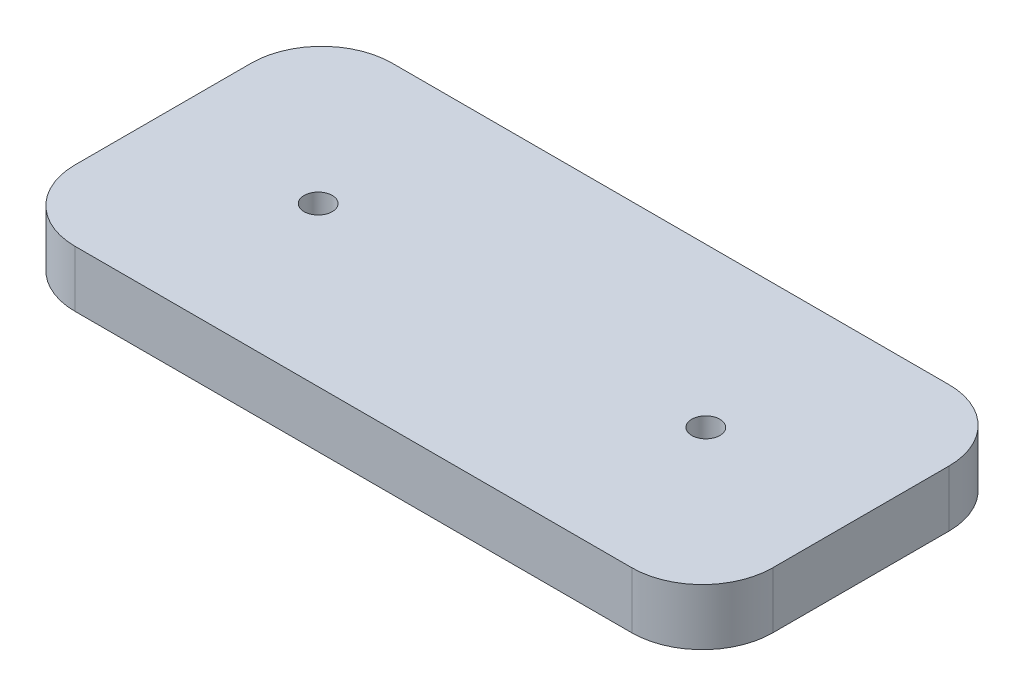
ISO-10303-21;
HEADER;
FILE_DESCRIPTION(('STEP AP214'),'2;1');
FILE_NAME('part.step','',(''),(''),'','','');
FILE_SCHEMA(('AUTOMOTIVE_DESIGN { 1 0 10303 214 1 1 1 1 }'));
ENDSEC;
DATA;
#1=APPLICATION_CONTEXT('core data for automotive mechanical design processes');
#2=APPLICATION_PROTOCOL_DEFINITION('international standard','automotive_design',2000,#1);
#3=PRODUCT_CONTEXT('',#1,'mechanical');
#4=PRODUCT('Part','Part','',(#3));
#5=PRODUCT_RELATED_PRODUCT_CATEGORY('part','',(#4));
#6=PRODUCT_DEFINITION_FORMATION('','',#4);
#7=PRODUCT_DEFINITION_CONTEXT('part definition',#1,'design');
#8=PRODUCT_DEFINITION('design','',#6,#7);
#9=PRODUCT_DEFINITION_SHAPE('','',#8);
#10=(LENGTH_UNIT() NAMED_UNIT(*) SI_UNIT(.MILLI.,.METRE.));
#11=(NAMED_UNIT(*) PLANE_ANGLE_UNIT() SI_UNIT($,.RADIAN.));
#12=(NAMED_UNIT(*) SI_UNIT($,.STERADIAN.) SOLID_ANGLE_UNIT());
#13=UNCERTAINTY_MEASURE_WITH_UNIT(LENGTH_MEASURE(1.E-05),#10,'distance_accuracy_value','');
#14=(GEOMETRIC_REPRESENTATION_CONTEXT(3) GLOBAL_UNCERTAINTY_ASSIGNED_CONTEXT((#13)) GLOBAL_UNIT_ASSIGNED_CONTEXT((#10,
#11,#12)) REPRESENTATION_CONTEXT('',''));
#15=CARTESIAN_POINT('',(0.,0.,0.));
#16=DIRECTION('',(0.,0.,1.));
#17=DIRECTION('',(1.,0.,0.));
#18=AXIS2_PLACEMENT_3D('',#15,#16,#17);
#19=CARTESIAN_POINT('',(0.,8.,0.));
#20=DIRECTION('',(0.,-1.,0.));
#21=DIRECTION('',(0.,0.,-1.));
#22=AXIS2_PLACEMENT_3D('',#19,#20,#21);
#23=PLANE('',#22);
#24=DIRECTION('',(-1.,0.,0.));
#25=VECTOR('',#24,1.);
#26=CARTESIAN_POINT('',(0.,8.,-45.));
#27=LINE('',#26,#25);
#28=CARTESIAN_POINT('',(89.,8.,-45.));
#29=VERTEX_POINT('',#28);
#30=CARTESIAN_POINT('',(10.,8.,-45.));
#31=VERTEX_POINT('',#30);
#32=EDGE_CURVE('E140',#29,#31,#27,.T.);
#33=ORIENTED_EDGE('',*,*,#32,.T.);
#34=CARTESIAN_POINT('',(10.,8.,-35.));
#35=DIRECTION('',(0.,-1.,0.));
#36=DIRECTION('',(0.,0.,-1.));
#37=AXIS2_PLACEMENT_3D('',#34,#35,#36);
#38=CIRCLE('',#37,10.);
#39=CARTESIAN_POINT('',(0.,8.,-35.));
#40=VERTEX_POINT('',#39);
#41=EDGE_CURVE('E159',#31,#40,#38,.F.);
#42=ORIENTED_EDGE('',*,*,#41,.T.);
#43=DIRECTION('',(0.,0.,1.));
#44=VECTOR('',#43,1.);
#45=CARTESIAN_POINT('',(0.,8.,0.));
#46=LINE('',#45,#44);
#47=CARTESIAN_POINT('',(0.,8.,-10.));
#48=VERTEX_POINT('',#47);
#49=EDGE_CURVE('E123',#40,#48,#46,.T.);
#50=ORIENTED_EDGE('',*,*,#49,.T.);
#51=CARTESIAN_POINT('',(10.,8.,-10.));
#52=DIRECTION('',(0.,-1.,0.));
#53=DIRECTION('',(0.,0.,-1.));
#54=AXIS2_PLACEMENT_3D('',#51,#52,#53);
#55=CIRCLE('',#54,10.);
#56=CARTESIAN_POINT('',(10.,8.,0.));
#57=VERTEX_POINT('',#56);
#58=EDGE_CURVE('E154',#48,#57,#55,.F.);
#59=ORIENTED_EDGE('',*,*,#58,.T.);
#60=DIRECTION('',(1.,0.,0.));
#61=VECTOR('',#60,1.);
#62=CARTESIAN_POINT('',(0.,8.,0.));
#63=LINE('',#62,#61);
#64=CARTESIAN_POINT('',(89.,8.,0.));
#65=VERTEX_POINT('',#64);
#66=EDGE_CURVE('E170',#57,#65,#63,.T.);
#67=ORIENTED_EDGE('',*,*,#66,.T.);
#68=CARTESIAN_POINT('',(89.,8.,-10.));
#69=DIRECTION('',(0.,-1.,0.));
#70=DIRECTION('',(0.,0.,-1.));
#71=AXIS2_PLACEMENT_3D('',#68,#69,#70);
#72=CIRCLE('',#71,10.);
#73=CARTESIAN_POINT('',(99.,8.,-10.));
#74=VERTEX_POINT('',#73);
#75=EDGE_CURVE('E59',#65,#74,#72,.F.);
#76=ORIENTED_EDGE('',*,*,#75,.T.);
#77=DIRECTION('',(0.,0.,-1.));
#78=VECTOR('',#77,1.);
#79=CARTESIAN_POINT('',(99.,8.,0.));
#80=LINE('',#79,#78);
#81=CARTESIAN_POINT('',(99.,8.,-35.));
#82=VERTEX_POINT('',#81);
#83=EDGE_CURVE('E178',#74,#82,#80,.T.);
#84=ORIENTED_EDGE('',*,*,#83,.T.);
#85=CARTESIAN_POINT('',(89.,8.,-35.));
#86=DIRECTION('',(0.,-1.,0.));
#87=DIRECTION('',(0.,0.,-1.));
#88=AXIS2_PLACEMENT_3D('',#85,#86,#87);
#89=CIRCLE('',#88,10.);
#90=EDGE_CURVE('E157',#82,#29,#89,.F.);
#91=ORIENTED_EDGE('',*,*,#90,.T.);
#92=EDGE_LOOP('',(#33,#42,#50,#59,#67,#76,#84,#91));
#93=FACE_BOUND('',#92,.T.);
#94=CARTESIAN_POINT('',(22.,8.,-22.5));
#95=DIRECTION('',(0.,1.,0.));
#96=DIRECTION('',(0.,0.,1.));
#97=AXIS2_PLACEMENT_3D('',#94,#95,#96);
#98=CIRCLE('',#97,2.);
#99=CARTESIAN_POINT('',(22.,8.,-20.5));
#100=VERTEX_POINT('',#99);
#101=EDGE_CURVE('E131',#100,#100,#98,.T.);
#102=ORIENTED_EDGE('',*,*,#101,.F.);
#103=EDGE_LOOP('',(#102));
#104=FACE_BOUND('',#103,.T.);
#105=CARTESIAN_POINT('',(77.,8.,-22.5));
#106=DIRECTION('',(0.,1.,0.));
#107=DIRECTION('',(0.,0.,-1.));
#108=AXIS2_PLACEMENT_3D('',#105,#106,#107);
#109=CIRCLE('',#108,2.);
#110=CARTESIAN_POINT('',(77.,8.,-24.5));
#111=VERTEX_POINT('',#110);
#112=EDGE_CURVE('E185',#111,#111,#109,.T.);
#113=ORIENTED_EDGE('',*,*,#112,.F.);
#114=EDGE_LOOP('',(#113));
#115=FACE_BOUND('',#114,.T.);
#116=ADVANCED_FACE('F37',(#93,#104,#115),#23,.F.);
#117=CARTESIAN_POINT('',(0.,0.,0.));
#118=DIRECTION('',(0.,-1.,0.));
#119=DIRECTION('',(0.,0.,-1.));
#120=AXIS2_PLACEMENT_3D('',#117,#118,#119);
#121=PLANE('',#120);
#122=CARTESIAN_POINT('',(22.,0.,-22.5));
#123=DIRECTION('',(0.,1.,0.));
#124=DIRECTION('',(0.,0.,1.));
#125=AXIS2_PLACEMENT_3D('',#122,#123,#124);
#126=CIRCLE('',#125,2.);
#127=CARTESIAN_POINT('',(22.,0.,-20.5));
#128=VERTEX_POINT('',#127);
#129=EDGE_CURVE('E137',#128,#128,#126,.T.);
#130=ORIENTED_EDGE('',*,*,#129,.T.);
#131=EDGE_LOOP('',(#130));
#132=FACE_BOUND('',#131,.T.);
#133=DIRECTION('',(0.,0.,1.));
#134=VECTOR('',#133,1.);
#135=CARTESIAN_POINT('',(0.,0.,0.));
#136=LINE('',#135,#134);
#137=CARTESIAN_POINT('',(0.,0.,-35.));
#138=VERTEX_POINT('',#137);
#139=CARTESIAN_POINT('',(0.,0.,-10.));
#140=VERTEX_POINT('',#139);
#141=EDGE_CURVE('E120',#138,#140,#136,.T.);
#142=ORIENTED_EDGE('',*,*,#141,.F.);
#143=CARTESIAN_POINT('',(10.,0.,-35.));
#144=DIRECTION('',(0.,-1.,0.));
#145=DIRECTION('',(0.,0.,-1.));
#146=AXIS2_PLACEMENT_3D('',#143,#144,#145);
#147=CIRCLE('',#146,10.);
#148=CARTESIAN_POINT('',(10.,0.,-45.));
#149=VERTEX_POINT('',#148);
#150=EDGE_CURVE('E103',#138,#149,#147,.T.);
#151=ORIENTED_EDGE('',*,*,#150,.T.);
#152=DIRECTION('',(-1.,0.,0.));
#153=VECTOR('',#152,1.);
#154=CARTESIAN_POINT('',(0.,0.,-45.));
#155=LINE('',#154,#153);
#156=CARTESIAN_POINT('',(89.,0.,-45.));
#157=VERTEX_POINT('',#156);
#158=EDGE_CURVE('E144',#157,#149,#155,.T.);
#159=ORIENTED_EDGE('',*,*,#158,.F.);
#160=CARTESIAN_POINT('',(89.,0.,-35.));
#161=DIRECTION('',(0.,-1.,0.));
#162=DIRECTION('',(0.,0.,-1.));
#163=AXIS2_PLACEMENT_3D('',#160,#161,#162);
#164=CIRCLE('',#163,10.);
#165=CARTESIAN_POINT('',(99.,0.,-35.));
#166=VERTEX_POINT('',#165);
#167=EDGE_CURVE('E114',#157,#166,#164,.T.);
#168=ORIENTED_EDGE('',*,*,#167,.T.);
#169=DIRECTION('',(0.,0.,-1.));
#170=VECTOR('',#169,1.);
#171=CARTESIAN_POINT('',(99.,0.,0.));
#172=LINE('',#171,#170);
#173=CARTESIAN_POINT('',(99.,0.,-10.));
#174=VERTEX_POINT('',#173);
#175=EDGE_CURVE('E134',#174,#166,#172,.T.);
#176=ORIENTED_EDGE('',*,*,#175,.F.);
#177=CARTESIAN_POINT('',(89.,0.,-10.));
#178=DIRECTION('',(0.,-1.,0.));
#179=DIRECTION('',(0.,0.,-1.));
#180=AXIS2_PLACEMENT_3D('',#177,#178,#179);
#181=CIRCLE('',#180,10.);
#182=CARTESIAN_POINT('',(89.,0.,0.));
#183=VERTEX_POINT('',#182);
#184=EDGE_CURVE('E148',#174,#183,#181,.T.);
#185=ORIENTED_EDGE('',*,*,#184,.T.);
#186=DIRECTION('',(1.,0.,0.));
#187=VECTOR('',#186,1.);
#188=CARTESIAN_POINT('',(0.,0.,0.));
#189=LINE('',#188,#187);
#190=CARTESIAN_POINT('',(10.,0.,0.));
#191=VERTEX_POINT('',#190);
#192=EDGE_CURVE('E130',#191,#183,#189,.T.);
#193=ORIENTED_EDGE('',*,*,#192,.F.);
#194=CARTESIAN_POINT('',(10.,0.,-10.));
#195=DIRECTION('',(0.,-1.,0.));
#196=DIRECTION('',(0.,0.,-1.));
#197=AXIS2_PLACEMENT_3D('',#194,#195,#196);
#198=CIRCLE('',#197,10.);
#199=EDGE_CURVE('E124',#191,#140,#198,.T.);
#200=ORIENTED_EDGE('',*,*,#199,.T.);
#201=EDGE_LOOP('',(#142,#151,#159,#168,#176,#185,#193,#200));
#202=FACE_BOUND('',#201,.T.);
#203=CARTESIAN_POINT('',(77.,0.,-22.5));
#204=DIRECTION('',(0.,1.,0.));
#205=DIRECTION('',(0.,0.,-1.));
#206=AXIS2_PLACEMENT_3D('',#203,#204,#205);
#207=CIRCLE('',#206,2.);
#208=CARTESIAN_POINT('',(77.,0.,-24.5));
#209=VERTEX_POINT('',#208);
#210=EDGE_CURVE('E187',#209,#209,#207,.T.);
#211=ORIENTED_EDGE('',*,*,#210,.T.);
#212=EDGE_LOOP('',(#211));
#213=FACE_BOUND('',#212,.T.);
#214=ADVANCED_FACE('F127',(#132,#202,#213),#121,.T.);
#215=CARTESIAN_POINT('',(0.,8.,0.));
#216=DIRECTION('',(1.,0.,0.));
#217=DIRECTION('',(0.,0.,-1.));
#218=AXIS2_PLACEMENT_3D('',#215,#216,#217);
#219=PLANE('',#218);
#220=ORIENTED_EDGE('',*,*,#49,.F.);
#221=DIRECTION('',(0.,-1.,0.));
#222=VECTOR('',#221,1.);
#223=CARTESIAN_POINT('',(0.,8.,-35.));
#224=LINE('',#223,#222);
#225=EDGE_CURVE('E107',#40,#138,#224,.T.);
#226=ORIENTED_EDGE('',*,*,#225,.T.);
#227=ORIENTED_EDGE('',*,*,#141,.T.);
#228=DIRECTION('',(0.,-1.,0.));
#229=VECTOR('',#228,1.);
#230=CARTESIAN_POINT('',(0.,8.,-10.));
#231=LINE('',#230,#229);
#232=EDGE_CURVE('E125',#140,#48,#231,.F.);
#233=ORIENTED_EDGE('',*,*,#232,.T.);
#234=EDGE_LOOP('',(#220,#226,#227,#233));
#235=FACE_BOUND('',#234,.T.);
#236=ADVANCED_FACE('F119',(#235),#219,.F.);
#237=CARTESIAN_POINT('',(0.,8.,0.));
#238=DIRECTION('',(0.,0.,-1.));
#239=DIRECTION('',(-1.,0.,0.));
#240=AXIS2_PLACEMENT_3D('',#237,#238,#239);
#241=PLANE('',#240);
#242=ORIENTED_EDGE('',*,*,#192,.T.);
#243=DIRECTION('',(0.,-1.,0.));
#244=VECTOR('',#243,1.);
#245=CARTESIAN_POINT('',(89.,8.,0.));
#246=LINE('',#245,#244);
#247=EDGE_CURVE('E11',#183,#65,#246,.F.);
#248=ORIENTED_EDGE('',*,*,#247,.T.);
#249=ORIENTED_EDGE('',*,*,#66,.F.);
#250=DIRECTION('',(0.,-1.,0.));
#251=VECTOR('',#250,1.);
#252=CARTESIAN_POINT('',(10.,8.,0.));
#253=LINE('',#252,#251);
#254=EDGE_CURVE('E45',#57,#191,#253,.T.);
#255=ORIENTED_EDGE('',*,*,#254,.T.);
#256=EDGE_LOOP('',(#242,#248,#249,#255));
#257=FACE_BOUND('',#256,.T.);
#258=ADVANCED_FACE('F168',(#257),#241,.F.);
#259=CARTESIAN_POINT('',(99.,8.,0.));
#260=DIRECTION('',(-1.,0.,0.));
#261=DIRECTION('',(0.,0.,1.));
#262=AXIS2_PLACEMENT_3D('',#259,#260,#261);
#263=PLANE('',#262);
#264=ORIENTED_EDGE('',*,*,#175,.T.);
#265=DIRECTION('',(0.,-1.,0.));
#266=VECTOR('',#265,1.);
#267=CARTESIAN_POINT('',(99.,8.,-35.));
#268=LINE('',#267,#266);
#269=EDGE_CURVE('E52',#166,#82,#268,.F.);
#270=ORIENTED_EDGE('',*,*,#269,.T.);
#271=ORIENTED_EDGE('',*,*,#83,.F.);
#272=DIRECTION('',(0.,-1.,0.));
#273=VECTOR('',#272,1.);
#274=CARTESIAN_POINT('',(99.,8.,-10.));
#275=LINE('',#274,#273);
#276=EDGE_CURVE('E161',#74,#174,#275,.T.);
#277=ORIENTED_EDGE('',*,*,#276,.T.);
#278=EDGE_LOOP('',(#264,#270,#271,#277));
#279=FACE_BOUND('',#278,.T.);
#280=ADVANCED_FACE('F177',(#279),#263,.F.);
#281=CARTESIAN_POINT('',(0.,8.,-45.));
#282=DIRECTION('',(0.,0.,1.));
#283=DIRECTION('',(1.,0.,0.));
#284=AXIS2_PLACEMENT_3D('',#281,#282,#283);
#285=PLANE('',#284);
#286=ORIENTED_EDGE('',*,*,#158,.T.);
#287=DIRECTION('',(0.,-1.,0.));
#288=VECTOR('',#287,1.);
#289=CARTESIAN_POINT('',(10.,8.,-45.));
#290=LINE('',#289,#288);
#291=EDGE_CURVE('E108',#149,#31,#290,.F.);
#292=ORIENTED_EDGE('',*,*,#291,.T.);
#293=ORIENTED_EDGE('',*,*,#32,.F.);
#294=DIRECTION('',(0.,-1.,0.));
#295=VECTOR('',#294,1.);
#296=CARTESIAN_POINT('',(89.,8.,-45.));
#297=LINE('',#296,#295);
#298=EDGE_CURVE('E113',#29,#157,#297,.T.);
#299=ORIENTED_EDGE('',*,*,#298,.T.);
#300=EDGE_LOOP('',(#286,#292,#293,#299));
#301=FACE_BOUND('',#300,.T.);
#302=ADVANCED_FACE('F208',(#301),#285,.F.);
#303=CARTESIAN_POINT('',(22.,8.,-22.5));
#304=DIRECTION('',(0.,-1.,0.));
#305=DIRECTION('',(0.,0.,-1.));
#306=AXIS2_PLACEMENT_3D('',#303,#304,#305);
#307=CYLINDRICAL_SURFACE('',#306,2.);
#308=ORIENTED_EDGE('',*,*,#101,.T.);
#309=EDGE_LOOP('',(#308));
#310=FACE_BOUND('',#309,.T.);
#311=ORIENTED_EDGE('',*,*,#129,.F.);
#312=EDGE_LOOP('',(#311));
#313=FACE_BOUND('',#312,.T.);
#314=ADVANCED_FACE('F205',(#310,#313),#307,.F.);
#315=CARTESIAN_POINT('',(77.,8.,-22.5));
#316=DIRECTION('',(0.,-1.,0.));
#317=DIRECTION('',(0.,0.,-1.));
#318=AXIS2_PLACEMENT_3D('',#315,#316,#317);
#319=CYLINDRICAL_SURFACE('',#318,2.);
#320=ORIENTED_EDGE('',*,*,#112,.T.);
#321=EDGE_LOOP('',(#320));
#322=FACE_BOUND('',#321,.T.);
#323=ORIENTED_EDGE('',*,*,#210,.F.);
#324=EDGE_LOOP('',(#323));
#325=FACE_BOUND('',#324,.T.);
#326=ADVANCED_FACE('F193',(#322,#325),#319,.F.);
#327=CARTESIAN_POINT('',(10.,8.,-35.));
#328=DIRECTION('',(0.,-1.,0.));
#329=DIRECTION('',(0.,0.,-1.));
#330=AXIS2_PLACEMENT_3D('',#327,#328,#329);
#331=CYLINDRICAL_SURFACE('',#330,10.);
#332=ORIENTED_EDGE('',*,*,#41,.F.);
#333=ORIENTED_EDGE('',*,*,#291,.F.);
#334=ORIENTED_EDGE('',*,*,#150,.F.);
#335=ORIENTED_EDGE('',*,*,#225,.F.);
#336=EDGE_LOOP('',(#332,#333,#334,#335));
#337=FACE_BOUND('',#336,.T.);
#338=ADVANCED_FACE('F106',(#337),#331,.T.);
#339=CARTESIAN_POINT('',(89.,8.,-35.));
#340=DIRECTION('',(0.,-1.,0.));
#341=DIRECTION('',(0.,0.,-1.));
#342=AXIS2_PLACEMENT_3D('',#339,#340,#341);
#343=CYLINDRICAL_SURFACE('',#342,10.);
#344=ORIENTED_EDGE('',*,*,#90,.F.);
#345=ORIENTED_EDGE('',*,*,#269,.F.);
#346=ORIENTED_EDGE('',*,*,#167,.F.);
#347=ORIENTED_EDGE('',*,*,#298,.F.);
#348=EDGE_LOOP('',(#344,#345,#346,#347));
#349=FACE_BOUND('',#348,.T.);
#350=ADVANCED_FACE('F220',(#349),#343,.T.);
#351=CARTESIAN_POINT('',(89.,8.,-10.));
#352=DIRECTION('',(0.,-1.,0.));
#353=DIRECTION('',(0.,0.,-1.));
#354=AXIS2_PLACEMENT_3D('',#351,#352,#353);
#355=CYLINDRICAL_SURFACE('',#354,10.);
#356=ORIENTED_EDGE('',*,*,#75,.F.);
#357=ORIENTED_EDGE('',*,*,#247,.F.);
#358=ORIENTED_EDGE('',*,*,#184,.F.);
#359=ORIENTED_EDGE('',*,*,#276,.F.);
#360=EDGE_LOOP('',(#356,#357,#358,#359));
#361=FACE_BOUND('',#360,.T.);
#362=ADVANCED_FACE('F176',(#361),#355,.T.);
#363=CARTESIAN_POINT('',(10.,8.,-10.));
#364=DIRECTION('',(0.,-1.,0.));
#365=DIRECTION('',(0.,0.,-1.));
#366=AXIS2_PLACEMENT_3D('',#363,#364,#365);
#367=CYLINDRICAL_SURFACE('',#366,10.);
#368=ORIENTED_EDGE('',*,*,#58,.F.);
#369=ORIENTED_EDGE('',*,*,#232,.F.);
#370=ORIENTED_EDGE('',*,*,#199,.F.);
#371=ORIENTED_EDGE('',*,*,#254,.F.);
#372=EDGE_LOOP('',(#368,#369,#370,#371));
#373=FACE_BOUND('',#372,.T.);
#374=ADVANCED_FACE('F39',(#373),#367,.T.);
#375=CLOSED_SHELL('',(#116,#214,#236,#258,#280,#302,#314,#326,#338,#350,#362,#374));
#376=MANIFOLD_SOLID_BREP('B2',#375);
#377=ADVANCED_BREP_SHAPE_REPRESENTATION('',(#18,#376),#14);
#378=SHAPE_DEFINITION_REPRESENTATION(#9,#377);
ENDSEC;
END-ISO-10303-21;
